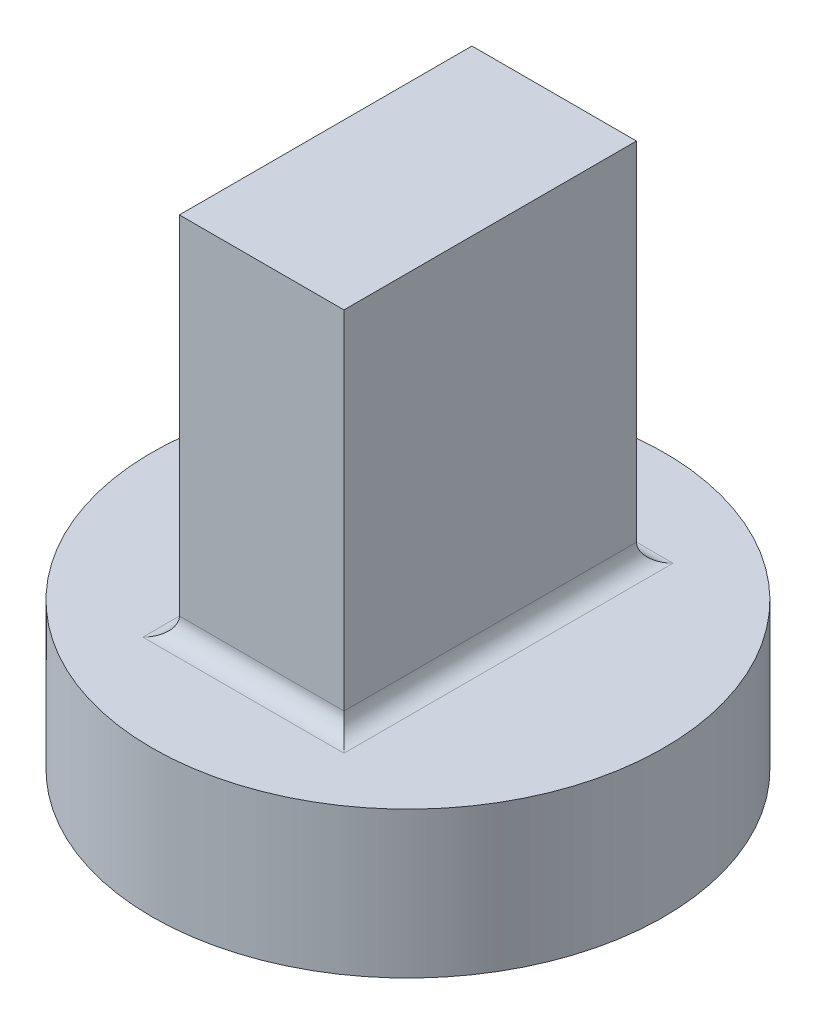
ISO-10303-21;
HEADER;
FILE_DESCRIPTION(('STEP AP214'),'2;1');
FILE_NAME('part.step','',(''),(''),'','','');
FILE_SCHEMA(('AUTOMOTIVE_DESIGN { 1 0 10303 214 1 1 1 1 }'));
ENDSEC;
DATA;
#1=APPLICATION_CONTEXT('core data for automotive mechanical design processes');
#2=APPLICATION_PROTOCOL_DEFINITION('international standard','automotive_design',2000,#1);
#3=PRODUCT_CONTEXT('',#1,'mechanical');
#4=PRODUCT('Part','Part','',(#3));
#5=PRODUCT_RELATED_PRODUCT_CATEGORY('part','',(#4));
#6=PRODUCT_DEFINITION_FORMATION('','',#4);
#7=PRODUCT_DEFINITION_CONTEXT('part definition',#1,'design');
#8=PRODUCT_DEFINITION('design','',#6,#7);
#9=PRODUCT_DEFINITION_SHAPE('','',#8);
#10=(LENGTH_UNIT() NAMED_UNIT(*) SI_UNIT(.MILLI.,.METRE.));
#11=(NAMED_UNIT(*) PLANE_ANGLE_UNIT() SI_UNIT($,.RADIAN.));
#12=(NAMED_UNIT(*) SI_UNIT($,.STERADIAN.) SOLID_ANGLE_UNIT());
#13=UNCERTAINTY_MEASURE_WITH_UNIT(LENGTH_MEASURE(1.E-05),#10,'distance_accuracy_value','');
#14=(GEOMETRIC_REPRESENTATION_CONTEXT(3) GLOBAL_UNCERTAINTY_ASSIGNED_CONTEXT((#13)) GLOBAL_UNIT_ASSIGNED_CONTEXT((#10,
#11,#12)) REPRESENTATION_CONTEXT('',''));
#15=CARTESIAN_POINT('',(0.,0.,0.));
#16=DIRECTION('',(0.,0.,1.));
#17=DIRECTION('',(1.,0.,0.));
#18=AXIS2_PLACEMENT_3D('',#15,#16,#17);
#19=CARTESIAN_POINT('',(0.,4.,0.));
#20=DIRECTION('',(0.,-1.,0.));
#21=DIRECTION('',(0.,0.,-1.));
#22=AXIS2_PLACEMENT_3D('',#19,#20,#21);
#23=CYLINDRICAL_SURFACE('',#22,7.);
#24=CARTESIAN_POINT('',(0.,4.,0.));
#25=DIRECTION('',(0.,1.,0.));
#26=DIRECTION('',(0.,0.,1.));
#27=AXIS2_PLACEMENT_3D('',#24,#25,#26);
#28=CIRCLE('',#27,7.);
#29=CARTESIAN_POINT('',(0.,4.,7.));
#30=VERTEX_POINT('',#29);
#31=EDGE_CURVE('E124',#30,#30,#28,.T.);
#32=ORIENTED_EDGE('',*,*,#31,.F.);
#33=EDGE_LOOP('',(#32));
#34=FACE_BOUND('',#33,.T.);
#35=CARTESIAN_POINT('',(0.,0.,0.));
#36=DIRECTION('',(0.,1.,0.));
#37=DIRECTION('',(0.,0.,1.));
#38=AXIS2_PLACEMENT_3D('',#35,#36,#37);
#39=CIRCLE('',#38,7.);
#40=CARTESIAN_POINT('',(0.,0.,7.));
#41=VERTEX_POINT('',#40);
#42=EDGE_CURVE('E119',#41,#41,#39,.T.);
#43=ORIENTED_EDGE('',*,*,#42,.T.);
#44=EDGE_LOOP('',(#43));
#45=FACE_BOUND('',#44,.T.);
#46=ADVANCED_FACE('F39',(#34,#45),#23,.T.);
#47=CARTESIAN_POINT('',(0.,4.,0.));
#48=DIRECTION('',(0.,1.,0.));
#49=DIRECTION('',(0.,0.,1.));
#50=AXIS2_PLACEMENT_3D('',#47,#48,#49);
#51=PLANE('',#50);
#52=DIRECTION('',(1.,0.,0.));
#53=VECTOR('',#52,1.);
#54=CARTESIAN_POINT('',(0.,4.,4.5));
#55=LINE('',#54,#53);
#56=CARTESIAN_POINT('',(2.75,4.,4.5));
#57=VERTEX_POINT('',#56);
#58=CARTESIAN_POINT('',(-2.75,4.,4.5));
#59=VERTEX_POINT('',#58);
#60=EDGE_CURVE('E141',#57,#59,#55,.F.);
#61=ORIENTED_EDGE('',*,*,#60,.T.);
#62=DIRECTION('',(0.,0.,1.));
#63=VECTOR('',#62,1.);
#64=CARTESIAN_POINT('',(-2.75,4.,0.));
#65=LINE('',#64,#63);
#66=CARTESIAN_POINT('',(-2.75,4.,-4.5));
#67=VERTEX_POINT('',#66);
#68=EDGE_CURVE('E144',#59,#67,#65,.F.);
#69=ORIENTED_EDGE('',*,*,#68,.T.);
#70=DIRECTION('',(-1.,0.,0.));
#71=VECTOR('',#70,1.);
#72=CARTESIAN_POINT('',(0.,4.,-4.5));
#73=LINE('',#72,#71);
#74=CARTESIAN_POINT('',(2.75,4.,-4.5));
#75=VERTEX_POINT('',#74);
#76=EDGE_CURVE('E135',#67,#75,#73,.F.);
#77=ORIENTED_EDGE('',*,*,#76,.T.);
#78=DIRECTION('',(0.,0.,-1.));
#79=VECTOR('',#78,1.);
#80=CARTESIAN_POINT('',(2.75,4.,0.));
#81=LINE('',#80,#79);
#82=EDGE_CURVE('E138',#75,#57,#81,.F.);
#83=ORIENTED_EDGE('',*,*,#82,.T.);
#84=EDGE_LOOP('',(#61,#69,#77,#83));
#85=FACE_BOUND('',#84,.T.);
#86=ORIENTED_EDGE('',*,*,#31,.T.);
#87=EDGE_LOOP('',(#86));
#88=FACE_BOUND('',#87,.T.);
#89=ADVANCED_FACE('F174',(#85,#88),#51,.T.);
#90=CARTESIAN_POINT('',(0.,0.,0.));
#91=DIRECTION('',(0.,1.,0.));
#92=DIRECTION('',(0.,0.,1.));
#93=AXIS2_PLACEMENT_3D('',#90,#91,#92);
#94=PLANE('',#93);
#95=ORIENTED_EDGE('',*,*,#42,.F.);
#96=EDGE_LOOP('',(#95));
#97=FACE_BOUND('',#96,.T.);
#98=ADVANCED_FACE('F194',(#97),#94,.F.);
#99=CARTESIAN_POINT('',(-2.25,14.,-4.));
#100=DIRECTION('',(1.,0.,0.));
#101=DIRECTION('',(0.,0.,-1.));
#102=AXIS2_PLACEMENT_3D('',#99,#100,#101);
#103=PLANE('',#102);
#104=DIRECTION('',(0.,-1.,0.));
#105=VECTOR('',#104,1.);
#106=CARTESIAN_POINT('',(-2.25,14.,-4.));
#107=LINE('',#106,#105);
#108=CARTESIAN_POINT('',(-2.25,14.,-4.));
#109=VERTEX_POINT('',#108);
#110=CARTESIAN_POINT('',(-2.25,4.5,-4.));
#111=VERTEX_POINT('',#110);
#112=EDGE_CURVE('E284',#109,#111,#107,.T.);
#113=ORIENTED_EDGE('',*,*,#112,.T.);
#114=DIRECTION('',(0.,0.,1.));
#115=VECTOR('',#114,1.);
#116=CARTESIAN_POINT('',(-2.25,4.5,-4.));
#117=LINE('',#116,#115);
#118=CARTESIAN_POINT('',(-2.25,4.5,4.));
#119=VERTEX_POINT('',#118);
#120=EDGE_CURVE('E117',#111,#119,#117,.T.);
#121=ORIENTED_EDGE('',*,*,#120,.T.);
#122=DIRECTION('',(0.,-1.,0.));
#123=VECTOR('',#122,1.);
#124=CARTESIAN_POINT('',(-2.25,14.,4.));
#125=LINE('',#124,#123);
#126=CARTESIAN_POINT('',(-2.25,14.,4.));
#127=VERTEX_POINT('',#126);
#128=EDGE_CURVE('E97',#127,#119,#125,.T.);
#129=ORIENTED_EDGE('',*,*,#128,.F.);
#130=DIRECTION('',(0.,0.,1.));
#131=VECTOR('',#130,1.);
#132=CARTESIAN_POINT('',(-2.25,14.,-4.));
#133=LINE('',#132,#131);
#134=EDGE_CURVE('E103',#109,#127,#133,.T.);
#135=ORIENTED_EDGE('',*,*,#134,.F.);
#136=EDGE_LOOP('',(#113,#121,#129,#135));
#137=FACE_BOUND('',#136,.T.);
#138=ADVANCED_FACE('F115',(#137),#103,.F.);
#139=CARTESIAN_POINT('',(-2.25,14.,4.));
#140=DIRECTION('',(0.,0.,-1.));
#141=DIRECTION('',(-1.,0.,0.));
#142=AXIS2_PLACEMENT_3D('',#139,#140,#141);
#143=PLANE('',#142);
#144=ORIENTED_EDGE('',*,*,#128,.T.);
#145=DIRECTION('',(1.,0.,0.));
#146=VECTOR('',#145,1.);
#147=CARTESIAN_POINT('',(-2.25,4.5,4.));
#148=LINE('',#147,#146);
#149=CARTESIAN_POINT('',(2.25,4.5,4.));
#150=VERTEX_POINT('',#149);
#151=EDGE_CURVE('E64',#119,#150,#148,.T.);
#152=ORIENTED_EDGE('',*,*,#151,.T.);
#153=DIRECTION('',(0.,-1.,0.));
#154=VECTOR('',#153,1.);
#155=CARTESIAN_POINT('',(2.25,14.,4.));
#156=LINE('',#155,#154);
#157=CARTESIAN_POINT('',(2.25,14.,4.));
#158=VERTEX_POINT('',#157);
#159=EDGE_CURVE('E98',#158,#150,#156,.T.);
#160=ORIENTED_EDGE('',*,*,#159,.F.);
#161=DIRECTION('',(1.,0.,0.));
#162=VECTOR('',#161,1.);
#163=CARTESIAN_POINT('',(-2.25,14.,4.));
#164=LINE('',#163,#162);
#165=EDGE_CURVE('E93',#127,#158,#164,.T.);
#166=ORIENTED_EDGE('',*,*,#165,.F.);
#167=EDGE_LOOP('',(#144,#152,#160,#166));
#168=FACE_BOUND('',#167,.T.);
#169=ADVANCED_FACE('F95',(#168),#143,.F.);
#170=CARTESIAN_POINT('',(2.25,14.,-4.));
#171=DIRECTION('',(-1.,0.,0.));
#172=DIRECTION('',(0.,0.,1.));
#173=AXIS2_PLACEMENT_3D('',#170,#171,#172);
#174=PLANE('',#173);
#175=ORIENTED_EDGE('',*,*,#159,.T.);
#176=DIRECTION('',(0.,0.,-1.));
#177=VECTOR('',#176,1.);
#178=CARTESIAN_POINT('',(2.25,4.5,-4.));
#179=LINE('',#178,#177);
#180=CARTESIAN_POINT('',(2.25,4.5,-4.));
#181=VERTEX_POINT('',#180);
#182=EDGE_CURVE('E49',#150,#181,#179,.T.);
#183=ORIENTED_EDGE('',*,*,#182,.T.);
#184=DIRECTION('',(0.,-1.,0.));
#185=VECTOR('',#184,1.);
#186=CARTESIAN_POINT('',(2.25,14.,-4.));
#187=LINE('',#186,#185);
#188=CARTESIAN_POINT('',(2.25,14.,-4.));
#189=VERTEX_POINT('',#188);
#190=EDGE_CURVE('E126',#189,#181,#187,.T.);
#191=ORIENTED_EDGE('',*,*,#190,.F.);
#192=DIRECTION('',(0.,0.,-1.));
#193=VECTOR('',#192,1.);
#194=CARTESIAN_POINT('',(2.25,14.,-4.));
#195=LINE('',#194,#193);
#196=EDGE_CURVE('E102',#158,#189,#195,.T.);
#197=ORIENTED_EDGE('',*,*,#196,.F.);
#198=EDGE_LOOP('',(#175,#183,#191,#197));
#199=FACE_BOUND('',#198,.T.);
#200=ADVANCED_FACE('F206',(#199),#174,.F.);
#201=CARTESIAN_POINT('',(-2.25,14.,-4.));
#202=DIRECTION('',(0.,0.,1.));
#203=DIRECTION('',(1.,0.,0.));
#204=AXIS2_PLACEMENT_3D('',#201,#202,#203);
#205=PLANE('',#204);
#206=ORIENTED_EDGE('',*,*,#190,.T.);
#207=DIRECTION('',(-1.,0.,0.));
#208=VECTOR('',#207,1.);
#209=CARTESIAN_POINT('',(-2.25,4.5,-4.));
#210=LINE('',#209,#208);
#211=EDGE_CURVE('E11',#181,#111,#210,.T.);
#212=ORIENTED_EDGE('',*,*,#211,.T.);
#213=ORIENTED_EDGE('',*,*,#112,.F.);
#214=DIRECTION('',(-1.,0.,0.));
#215=VECTOR('',#214,1.);
#216=CARTESIAN_POINT('',(-2.25,14.,-4.));
#217=LINE('',#216,#215);
#218=EDGE_CURVE('E108',#189,#109,#217,.T.);
#219=ORIENTED_EDGE('',*,*,#218,.F.);
#220=EDGE_LOOP('',(#206,#212,#213,#219));
#221=FACE_BOUND('',#220,.T.);
#222=ADVANCED_FACE('F209',(#221),#205,.F.);
#223=CARTESIAN_POINT('',(0.,14.,0.));
#224=DIRECTION('',(0.,1.,0.));
#225=DIRECTION('',(0.,0.,1.));
#226=AXIS2_PLACEMENT_3D('',#223,#224,#225);
#227=PLANE('',#226);
#228=ORIENTED_EDGE('',*,*,#134,.T.);
#229=ORIENTED_EDGE('',*,*,#165,.T.);
#230=ORIENTED_EDGE('',*,*,#196,.T.);
#231=ORIENTED_EDGE('',*,*,#218,.T.);
#232=EDGE_LOOP('',(#228,#229,#230,#231));
#233=FACE_BOUND('',#232,.T.);
#234=ADVANCED_FACE('F106',(#233),#227,.T.);
#235=CARTESIAN_POINT('',(2.75,4.5,-4.));
#236=DIRECTION('',(0.,0.,-1.));
#237=DIRECTION('',(-1.,0.,0.));
#238=AXIS2_PLACEMENT_3D('',#235,#236,#237);
#239=CYLINDRICAL_SURFACE('',#238,0.5);
#240=CARTESIAN_POINT('',(2.75,4.5,4.5));
#241=DIRECTION('',(0.707106781186547,0.,-0.707106781186548));
#242=DIRECTION('',(-0.707106781186547,0.,-0.707106781186547));
#243=AXIS2_PLACEMENT_3D('',#240,#241,#242);
#244=ELLIPSE('',#243,0.707106781186548,0.5);
#245=EDGE_CURVE('E157',#57,#150,#244,.T.);
#246=ORIENTED_EDGE('',*,*,#245,.F.);
#247=ORIENTED_EDGE('',*,*,#82,.F.);
#248=CARTESIAN_POINT('',(2.75,4.5,-4.5));
#249=DIRECTION('',(-0.707106781186547,0.,-0.707106781186547));
#250=DIRECTION('',(-0.707106781186547,0.,0.707106781186548));
#251=AXIS2_PLACEMENT_3D('',#248,#249,#250);
#252=ELLIPSE('',#251,0.707106781186547,0.5);
#253=EDGE_CURVE('E43',#181,#75,#252,.F.);
#254=ORIENTED_EDGE('',*,*,#253,.F.);
#255=ORIENTED_EDGE('',*,*,#182,.F.);
#256=EDGE_LOOP('',(#246,#247,#254,#255));
#257=FACE_BOUND('',#256,.T.);
#258=ADVANCED_FACE('F41',(#257),#239,.F.);
#259=CARTESIAN_POINT('',(-2.25,4.5,-4.5));
#260=DIRECTION('',(-1.,0.,0.));
#261=DIRECTION('',(0.,0.,1.));
#262=AXIS2_PLACEMENT_3D('',#259,#260,#261);
#263=CYLINDRICAL_SURFACE('',#262,0.5);
#264=ORIENTED_EDGE('',*,*,#253,.T.);
#265=ORIENTED_EDGE('',*,*,#76,.F.);
#266=CARTESIAN_POINT('',(-2.75,4.5,-4.5));
#267=DIRECTION('',(-0.707106781186547,0.,0.707106781186548));
#268=DIRECTION('',(-0.707106781186547,0.,-0.707106781186547));
#269=AXIS2_PLACEMENT_3D('',#266,#267,#268);
#270=ELLIPSE('',#269,0.707106781186548,0.5);
#271=EDGE_CURVE('E155',#111,#67,#270,.F.);
#272=ORIENTED_EDGE('',*,*,#271,.F.);
#273=ORIENTED_EDGE('',*,*,#211,.F.);
#274=EDGE_LOOP('',(#264,#265,#272,#273));
#275=FACE_BOUND('',#274,.T.);
#276=ADVANCED_FACE('F169',(#275),#263,.F.);
#277=CARTESIAN_POINT('',(-2.25,4.5,4.5));
#278=DIRECTION('',(1.,0.,0.));
#279=DIRECTION('',(0.,0.,-1.));
#280=AXIS2_PLACEMENT_3D('',#277,#278,#279);
#281=CYLINDRICAL_SURFACE('',#280,0.5);
#282=ORIENTED_EDGE('',*,*,#245,.T.);
#283=ORIENTED_EDGE('',*,*,#151,.F.);
#284=CARTESIAN_POINT('',(-2.75,4.5,4.5));
#285=DIRECTION('',(0.707106781186547,0.,0.707106781186547));
#286=DIRECTION('',(0.707106781186547,0.,-0.707106781186548));
#287=AXIS2_PLACEMENT_3D('',#284,#285,#286);
#288=ELLIPSE('',#287,0.707106781186547,0.5);
#289=EDGE_CURVE('E152',#59,#119,#288,.T.);
#290=ORIENTED_EDGE('',*,*,#289,.F.);
#291=ORIENTED_EDGE('',*,*,#60,.F.);
#292=EDGE_LOOP('',(#282,#283,#290,#291));
#293=FACE_BOUND('',#292,.T.);
#294=ADVANCED_FACE('F180',(#293),#281,.F.);
#295=CARTESIAN_POINT('',(-2.75,4.5,-4.));
#296=DIRECTION('',(0.,0.,1.));
#297=DIRECTION('',(1.,0.,0.));
#298=AXIS2_PLACEMENT_3D('',#295,#296,#297);
#299=CYLINDRICAL_SURFACE('',#298,0.5);
#300=ORIENTED_EDGE('',*,*,#271,.T.);
#301=ORIENTED_EDGE('',*,*,#68,.F.);
#302=ORIENTED_EDGE('',*,*,#289,.T.);
#303=ORIENTED_EDGE('',*,*,#120,.F.);
#304=EDGE_LOOP('',(#300,#301,#302,#303));
#305=FACE_BOUND('',#304,.T.);
#306=ADVANCED_FACE('F179',(#305),#299,.F.);
#307=CLOSED_SHELL('',(#46,#89,#98,#138,#169,#200,#222,#234,#258,#276,#294,#306));
#308=MANIFOLD_SOLID_BREP('B2',#307);
#309=ADVANCED_BREP_SHAPE_REPRESENTATION('',(#18,#308),#14);
#310=SHAPE_DEFINITION_REPRESENTATION(#9,#309);
ENDSEC;
END-ISO-10303-21;
